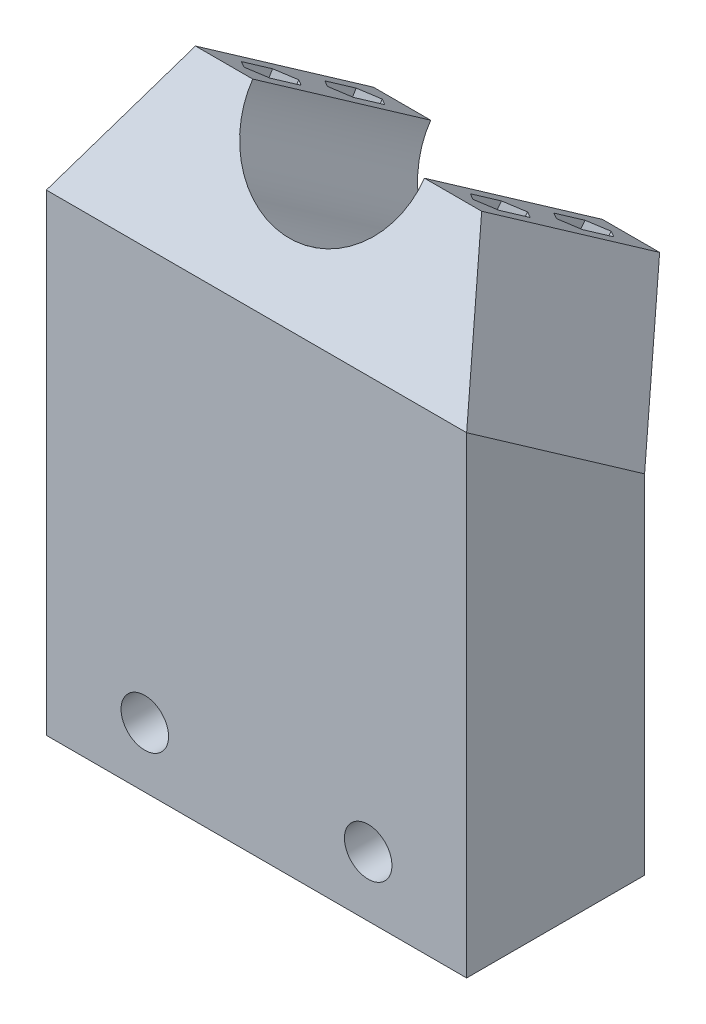
ISO-10303-21;
HEADER;
FILE_DESCRIPTION(('STEP AP214'),'2;1');
FILE_NAME('part.step','',(''),(''),'','','');
FILE_SCHEMA(('AUTOMOTIVE_DESIGN { 1 0 10303 214 1 1 1 1 }'));
ENDSEC;
DATA;
#1=APPLICATION_CONTEXT('core data for automotive mechanical design processes');
#2=APPLICATION_PROTOCOL_DEFINITION('international standard','automotive_design',2000,#1);
#3=PRODUCT_CONTEXT('',#1,'mechanical');
#4=PRODUCT('Part','Part','',(#3));
#5=PRODUCT_RELATED_PRODUCT_CATEGORY('part','',(#4));
#6=PRODUCT_DEFINITION_FORMATION('','',#4);
#7=PRODUCT_DEFINITION_CONTEXT('part definition',#1,'design');
#8=PRODUCT_DEFINITION('design','',#6,#7);
#9=PRODUCT_DEFINITION_SHAPE('','',#8);
#10=(LENGTH_UNIT() NAMED_UNIT(*) SI_UNIT(.MILLI.,.METRE.));
#11=(NAMED_UNIT(*) PLANE_ANGLE_UNIT() SI_UNIT($,.RADIAN.));
#12=(NAMED_UNIT(*) SI_UNIT($,.STERADIAN.) SOLID_ANGLE_UNIT());
#13=UNCERTAINTY_MEASURE_WITH_UNIT(LENGTH_MEASURE(1.E-05),#10,'distance_accuracy_value','');
#14=(GEOMETRIC_REPRESENTATION_CONTEXT(3) GLOBAL_UNCERTAINTY_ASSIGNED_CONTEXT((#13)) GLOBAL_UNIT_ASSIGNED_CONTEXT((#10,
#11,#12)) REPRESENTATION_CONTEXT('',''));
#15=CARTESIAN_POINT('',(0.,0.,0.));
#16=DIRECTION('',(0.,0.,1.));
#17=DIRECTION('',(1.,0.,0.));
#18=AXIS2_PLACEMENT_3D('',#15,#16,#17);
#19=CARTESIAN_POINT('',(0.,61.7872093725029,10.0494784547343));
#20=DIRECTION('',(0.,0.819152044288991,-0.573576436351047));
#21=DIRECTION('',(0.,0.573576436351048,0.819152044288991));
#22=AXIS2_PLACEMENT_3D('',#19,#20,#21);
#23=PLANE('',#22);
#24=DIRECTION('',(1.,0.,0.));
#25=VECTOR('',#24,1.);
#26=CARTESIAN_POINT('',(0.,48.7261506363349,-8.60364654526572));
#27=LINE('',#26,#25);
#28=CARTESIAN_POINT('',(7.0265625,48.7261506363349,-8.60364654526572));
#29=VERTEX_POINT('',#28);
#30=CARTESIAN_POINT('',(13.0265625,48.7261506363349,-8.60364654526572));
#31=VERTEX_POINT('',#30);
#32=EDGE_CURVE('E234',#29,#31,#27,.T.);
#33=ORIENTED_EDGE('',*,*,#32,.F.);
#34=DIRECTION('',(0.,-0.573576436351047,-0.819152044288991));
#35=VECTOR('',#34,1.);
#36=CARTESIAN_POINT('',(7.0265625,61.7872093725029,10.0494784547343));
#37=LINE('',#36,#35);
#38=CARTESIAN_POINT('',(7.0265625,61.7872093725029,10.0494784547343));
#39=VERTEX_POINT('',#38);
#40=EDGE_CURVE('E277',#39,#29,#37,.T.);
#41=ORIENTED_EDGE('',*,*,#40,.F.);
#42=DIRECTION('',(1.,0.,0.));
#43=VECTOR('',#42,1.);
#44=CARTESIAN_POINT('',(0.,61.7872093725029,10.0494784547343));
#45=LINE('',#44,#43);
#46=CARTESIAN_POINT('',(13.0265625,61.7872093725029,10.0494784547343));
#47=VERTEX_POINT('',#46);
#48=EDGE_CURVE('E235',#39,#47,#45,.T.);
#49=ORIENTED_EDGE('',*,*,#48,.T.);
#50=DIRECTION('',(0.,-0.573576436351047,-0.819152044288991));
#51=VECTOR('',#50,1.);
#52=CARTESIAN_POINT('',(13.0265625,61.7872093725029,10.0494784547343));
#53=LINE('',#52,#51);
#54=EDGE_CURVE('E251',#47,#31,#53,.T.);
#55=ORIENTED_EDGE('',*,*,#54,.T.);
#56=EDGE_LOOP('',(#33,#41,#49,#55));
#57=FACE_BOUND('',#56,.T.);
#58=DIRECTION('',(0.,0.573576436351046,0.819152044288991));
#59=VECTOR('',#58,1.);
#60=CARTESIAN_POINT('',(8.5265625,61.7872093725029,10.0494784547343));
#61=LINE('',#60,#59);
#62=CARTESIAN_POINT('',(8.5265625,53.3377051845973,-2.01766410918222));
#63=VERTEX_POINT('',#62);
#64=CARTESIAN_POINT('',(8.5265625,51.0433994391931,-5.2942722863382));
#65=VERTEX_POINT('',#64);
#66=EDGE_CURVE('E228',#63,#65,#61,.F.);
#67=ORIENTED_EDGE('',*,*,#66,.T.);
#68=DIRECTION('',(-0.707106781186548,0.405579787672639,0.579227965339568));
#69=VECTOR('',#68,1.);
#70=CARTESIAN_POINT('',(22.0265625,43.300117548454,-16.3528248842395));
#71=LINE('',#70,#69);
#72=CARTESIAN_POINT('',(10.0265625,50.1830347846665,-6.52300035277167));
#73=VERTEX_POINT('',#72);
#74=EDGE_CURVE('E231',#65,#73,#71,.F.);
#75=ORIENTED_EDGE('',*,*,#74,.T.);
#76=DIRECTION('',(0.707106781186548,0.40557978767264,0.579227965339568));
#77=VECTOR('',#76,1.);
#78=CARTESIAN_POINT('',(22.0265625,57.0659520208791,3.3068241786962));
#79=LINE('',#78,#77);
#80=CARTESIAN_POINT('',(11.5265625,51.0433994391931,-5.29427228633819));
#81=VERTEX_POINT('',#80);
#82=EDGE_CURVE('E216',#73,#81,#79,.T.);
#83=ORIENTED_EDGE('',*,*,#82,.T.);
#84=DIRECTION('',(0.,0.573576436351046,0.819152044288991));
#85=VECTOR('',#84,1.);
#86=CARTESIAN_POINT('',(11.5265625,61.7872093725029,10.0494784547343));
#87=LINE('',#86,#85);
#88=CARTESIAN_POINT('',(11.5265625,53.3377051845973,-2.01766410918222));
#89=VERTEX_POINT('',#88);
#90=EDGE_CURVE('E219',#81,#89,#87,.T.);
#91=ORIENTED_EDGE('',*,*,#90,.T.);
#92=DIRECTION('',(-0.707106781186554,0.405579787672636,0.579227965339563));
#93=VECTOR('',#92,1.);
#94=CARTESIAN_POINT('',(22.0265625,47.3151526029114,-10.6187605742164));
#95=LINE('',#94,#93);
#96=CARTESIAN_POINT('',(10.0265625,54.1980698391239,-0.788936042748746));
#97=VERTEX_POINT('',#96);
#98=EDGE_CURVE('E222',#89,#97,#95,.T.);
#99=ORIENTED_EDGE('',*,*,#98,.T.);
#100=DIRECTION('',(0.70710678118655,0.405579787672639,0.579227965339567));
#101=VECTOR('',#100,1.);
#102=CARTESIAN_POINT('',(22.0265625,61.0809870753364,9.04088848871909));
#103=LINE('',#102,#101);
#104=EDGE_CURVE('E225',#97,#63,#103,.F.);
#105=ORIENTED_EDGE('',*,*,#104,.T.);
#106=EDGE_LOOP('',(#67,#75,#83,#91,#99,#105));
#107=FACE_BOUND('',#106,.T.);
#108=DIRECTION('',(0.,0.573576436351046,0.819152044288991));
#109=VECTOR('',#108,1.);
#110=CARTESIAN_POINT('',(11.5265625,61.7872093725029,10.0494784547343));
#111=LINE('',#110,#109);
#112=CARTESIAN_POINT('',(11.5265625,57.1756548242405,3.46349601865079));
#113=VERTEX_POINT('',#112);
#114=CARTESIAN_POINT('',(11.5265625,59.4699605696447,6.74010419580678));
#115=VERTEX_POINT('',#114);
#116=EDGE_CURVE('E168',#113,#115,#111,.T.);
#117=ORIENTED_EDGE('',*,*,#116,.T.);
#118=DIRECTION('',(-0.70710678118655,0.405579787672638,0.579227965339566));
#119=VECTOR('',#118,1.);
#120=CARTESIAN_POINT('',(22.0265625,53.4474079879587,-1.86099226922756));
#121=LINE('',#120,#119);
#122=CARTESIAN_POINT('',(10.0265625,60.3303252241713,7.96883226224026));
#123=VERTEX_POINT('',#122);
#124=EDGE_CURVE('E197',#115,#123,#121,.T.);
#125=ORIENTED_EDGE('',*,*,#124,.T.);
#126=DIRECTION('',(0.70710678118655,0.405579787672638,0.579227965339566));
#127=VECTOR('',#126,1.);
#128=CARTESIAN_POINT('',(22.0265625,67.2132424603838,17.7986567937081));
#129=LINE('',#128,#127);
#130=CARTESIAN_POINT('',(8.5265625,59.4699605696447,6.74010419580678));
#131=VERTEX_POINT('',#130);
#132=EDGE_CURVE('E194',#123,#131,#129,.F.);
#133=ORIENTED_EDGE('',*,*,#132,.T.);
#134=DIRECTION('',(0.,0.573576436351046,0.819152044288991));
#135=VECTOR('',#134,1.);
#136=CARTESIAN_POINT('',(8.5265625,61.7872093725029,10.0494784547343));
#137=LINE('',#136,#135);
#138=CARTESIAN_POINT('',(8.5265625,57.1756548242405,3.46349601865081));
#139=VERTEX_POINT('',#138);
#140=EDGE_CURVE('E189',#131,#139,#137,.F.);
#141=ORIENTED_EDGE('',*,*,#140,.T.);
#142=DIRECTION('',(-0.707106781186551,0.405579787672638,0.579227965339565));
#143=VECTOR('',#142,1.);
#144=CARTESIAN_POINT('',(22.0265625,49.4323729335014,-7.59505657925045));
#145=LINE('',#144,#143);
#146=CARTESIAN_POINT('',(10.0265625,56.3152901697139,2.23476795221733));
#147=VERTEX_POINT('',#146);
#148=EDGE_CURVE('E187',#139,#147,#145,.F.);
#149=ORIENTED_EDGE('',*,*,#148,.T.);
#150=DIRECTION('',(0.707106781186556,0.405579787672635,0.579227965339561));
#151=VECTOR('',#150,1.);
#152=CARTESIAN_POINT('',(22.0265625,63.1982074059263,12.064592483685));
#153=LINE('',#152,#151);
#154=EDGE_CURVE('E173',#147,#113,#153,.T.);
#155=ORIENTED_EDGE('',*,*,#154,.T.);
#156=EDGE_LOOP('',(#117,#125,#133,#141,#149,#155));
#157=FACE_BOUND('',#156,.T.);
#158=ADVANCED_FACE('F47',(#57,#107,#157),#23,.T.);
#159=CARTESIAN_POINT('',(0.,61.7872093725029,10.0494784547343));
#160=DIRECTION('',(0.,0.819152044288991,-0.573576436351047));
#161=DIRECTION('',(0.,0.573576436351048,0.819152044288991));
#162=AXIS2_PLACEMENT_3D('',#159,#160,#161);
#163=PLANE('',#162);
#164=DIRECTION('',(1.,0.,0.));
#165=VECTOR('',#164,1.);
#166=CARTESIAN_POINT('',(0.,48.7261506363349,-8.60364654526572));
#167=LINE('',#166,#165);
#168=CARTESIAN_POINT('',(31.0265625,48.7261506363349,-8.60364654526572));
#169=VERTEX_POINT('',#168);
#170=CARTESIAN_POINT('',(37.0265625,48.7261506363349,-8.60364654526572));
#171=VERTEX_POINT('',#170);
#172=EDGE_CURVE('E261',#169,#171,#167,.T.);
#173=ORIENTED_EDGE('',*,*,#172,.F.);
#174=DIRECTION('',(0.,-0.573576436351047,-0.819152044288991));
#175=VECTOR('',#174,1.);
#176=CARTESIAN_POINT('',(31.0265625,61.7872093725029,10.0494784547343));
#177=LINE('',#176,#175);
#178=CARTESIAN_POINT('',(31.0265625,61.7872093725029,10.0494784547343));
#179=VERTEX_POINT('',#178);
#180=EDGE_CURVE('E267',#179,#169,#177,.T.);
#181=ORIENTED_EDGE('',*,*,#180,.F.);
#182=DIRECTION('',(1.,0.,0.));
#183=VECTOR('',#182,1.);
#184=CARTESIAN_POINT('',(0.,61.7872093725029,10.0494784547343));
#185=LINE('',#184,#183);
#186=CARTESIAN_POINT('',(37.0265625,61.7872093725029,10.0494784547343));
#187=VERTEX_POINT('',#186);
#188=EDGE_CURVE('E245',#179,#187,#185,.T.);
#189=ORIENTED_EDGE('',*,*,#188,.T.);
#190=DIRECTION('',(0.,-0.573576436351047,-0.819152044288991));
#191=VECTOR('',#190,1.);
#192=CARTESIAN_POINT('',(37.0265625,61.7872093725029,10.0494784547343));
#193=LINE('',#192,#191);
#194=EDGE_CURVE('E269',#187,#171,#193,.T.);
#195=ORIENTED_EDGE('',*,*,#194,.T.);
#196=EDGE_LOOP('',(#173,#181,#189,#195));
#197=FACE_BOUND('',#196,.T.);
#198=DIRECTION('',(0.707106781186548,-0.40557978767264,-0.579227965339568));
#199=VECTOR('',#198,1.);
#200=CARTESIAN_POINT('',(22.0265625,57.0659520208791,3.3068241786962));
#201=LINE('',#200,#199);
#202=CARTESIAN_POINT('',(32.5265625,51.0433994391931,-5.29427228633819));
#203=VERTEX_POINT('',#202);
#204=CARTESIAN_POINT('',(34.0265625,50.1830347846665,-6.52300035277168));
#205=VERTEX_POINT('',#204);
#206=EDGE_CURVE('E279',#203,#205,#201,.T.);
#207=ORIENTED_EDGE('',*,*,#206,.T.);
#208=DIRECTION('',(-0.707106781186548,-0.405579787672639,-0.579227965339568));
#209=VECTOR('',#208,1.);
#210=CARTESIAN_POINT('',(22.0265625,43.300117548454,-16.3528248842395));
#211=LINE('',#210,#209);
#212=CARTESIAN_POINT('',(35.5265625,51.0433994391931,-5.2942722863382));
#213=VERTEX_POINT('',#212);
#214=EDGE_CURVE('E294',#205,#213,#211,.F.);
#215=ORIENTED_EDGE('',*,*,#214,.T.);
#216=DIRECTION('',(0.,0.573576436351046,0.819152044288991));
#217=VECTOR('',#216,1.);
#218=CARTESIAN_POINT('',(35.5265625,61.7872093725029,10.0494784547343));
#219=LINE('',#218,#217);
#220=CARTESIAN_POINT('',(35.5265625,53.3377051845973,-2.01766410918222));
#221=VERTEX_POINT('',#220);
#222=EDGE_CURVE('E291',#213,#221,#219,.T.);
#223=ORIENTED_EDGE('',*,*,#222,.T.);
#224=DIRECTION('',(0.70710678118655,-0.405579787672639,-0.579227965339567));
#225=VECTOR('',#224,1.);
#226=CARTESIAN_POINT('',(22.0265625,61.0809870753364,9.04088848871909));
#227=LINE('',#226,#225);
#228=CARTESIAN_POINT('',(34.0265625,54.1980698391239,-0.788936042748746));
#229=VERTEX_POINT('',#228);
#230=EDGE_CURVE('E288',#221,#229,#227,.F.);
#231=ORIENTED_EDGE('',*,*,#230,.T.);
#232=DIRECTION('',(-0.707106781186554,-0.405579787672636,-0.579227965339563));
#233=VECTOR('',#232,1.);
#234=CARTESIAN_POINT('',(22.0265625,47.3151526029114,-10.6187605742164));
#235=LINE('',#234,#233);
#236=CARTESIAN_POINT('',(32.5265625,53.3377051845973,-2.01766410918222));
#237=VERTEX_POINT('',#236);
#238=EDGE_CURVE('E285',#229,#237,#235,.T.);
#239=ORIENTED_EDGE('',*,*,#238,.T.);
#240=DIRECTION('',(0.,0.573576436351046,0.819152044288991));
#241=VECTOR('',#240,1.);
#242=CARTESIAN_POINT('',(32.5265625,61.7872093725029,10.0494784547343));
#243=LINE('',#242,#241);
#244=EDGE_CURVE('E282',#237,#203,#243,.F.);
#245=ORIENTED_EDGE('',*,*,#244,.T.);
#246=EDGE_LOOP('',(#207,#215,#223,#231,#239,#245));
#247=FACE_BOUND('',#246,.T.);
#248=DIRECTION('',(0.70710678118655,-0.405579787672638,-0.579227965339566));
#249=VECTOR('',#248,1.);
#250=CARTESIAN_POINT('',(22.0265625,67.2132424603838,17.7986567937081));
#251=LINE('',#250,#249);
#252=CARTESIAN_POINT('',(35.5265625,59.4699605696447,6.74010419580678));
#253=VERTEX_POINT('',#252);
#254=CARTESIAN_POINT('',(34.0265625,60.3303252241713,7.96883226224026));
#255=VERTEX_POINT('',#254);
#256=EDGE_CURVE('E54',#253,#255,#251,.F.);
#257=ORIENTED_EDGE('',*,*,#256,.T.);
#258=DIRECTION('',(-0.70710678118655,-0.405579787672638,-0.579227965339566));
#259=VECTOR('',#258,1.);
#260=CARTESIAN_POINT('',(22.0265625,53.4474079879587,-1.86099226922756));
#261=LINE('',#260,#259);
#262=CARTESIAN_POINT('',(32.5265625,59.4699605696447,6.74010419580678));
#263=VERTEX_POINT('',#262);
#264=EDGE_CURVE('E12',#255,#263,#261,.T.);
#265=ORIENTED_EDGE('',*,*,#264,.T.);
#266=DIRECTION('',(0.,0.573576436351046,0.819152044288991));
#267=VECTOR('',#266,1.);
#268=CARTESIAN_POINT('',(32.5265625,61.7872093725029,10.0494784547343));
#269=LINE('',#268,#267);
#270=CARTESIAN_POINT('',(32.5265625,57.1756548242405,3.46349601865079));
#271=VERTEX_POINT('',#270);
#272=EDGE_CURVE('E297',#263,#271,#269,.F.);
#273=ORIENTED_EDGE('',*,*,#272,.T.);
#274=DIRECTION('',(0.707106781186556,-0.405579787672635,-0.579227965339561));
#275=VECTOR('',#274,1.);
#276=CARTESIAN_POINT('',(22.0265625,63.1982074059263,12.064592483685));
#277=LINE('',#276,#275);
#278=CARTESIAN_POINT('',(34.0265625,56.3152901697139,2.23476795221733));
#279=VERTEX_POINT('',#278);
#280=EDGE_CURVE('E181',#271,#279,#277,.T.);
#281=ORIENTED_EDGE('',*,*,#280,.T.);
#282=DIRECTION('',(-0.707106781186551,-0.405579787672638,-0.579227965339565));
#283=VECTOR('',#282,1.);
#284=CARTESIAN_POINT('',(22.0265625,49.4323729335014,-7.59505657925045));
#285=LINE('',#284,#283);
#286=CARTESIAN_POINT('',(35.5265625,57.1756548242405,3.46349601865081));
#287=VERTEX_POINT('',#286);
#288=EDGE_CURVE('E300',#279,#287,#285,.F.);
#289=ORIENTED_EDGE('',*,*,#288,.T.);
#290=DIRECTION('',(0.,0.573576436351046,0.819152044288991));
#291=VECTOR('',#290,1.);
#292=CARTESIAN_POINT('',(35.5265625,61.7872093725029,10.0494784547343));
#293=LINE('',#292,#291);
#294=EDGE_CURVE('E303',#287,#253,#293,.T.);
#295=ORIENTED_EDGE('',*,*,#294,.T.);
#296=EDGE_LOOP('',(#257,#265,#273,#281,#289,#295));
#297=FACE_BOUND('',#296,.T.);
#298=ADVANCED_FACE('F307',(#197,#247,#297),#163,.T.);
#299=CARTESIAN_POINT('',(-11.466289020113,29.4489419890561,32.692977049265));
#300=DIRECTION('',(0.905567661357585,-0.347485813738611,0.243312186200712));
#301=DIRECTION('',(0.358251992012855,0.933624930161369,0.));
#302=AXIS2_PLACEMENT_3D('',#299,#300,#301);
#303=PLANE('',#302);
#304=DIRECTION('',(-0.424201851367193,-0.741797601043066,0.519412272076236));
#305=VECTOR('',#304,1.);
#306=CARTESIAN_POINT('',(-11.466289020113,16.3878832528881,14.039852049265));
#307=LINE('',#306,#305);
#308=CARTESIAN_POINT('',(0.,36.438869972,0.));
#309=VERTEX_POINT('',#308);
#310=EDGE_CURVE('E254',#29,#309,#307,.T.);
#311=ORIENTED_EDGE('',*,*,#310,.T.);
#312=DIRECTION('',(0.,-0.573576436351047,-0.819152044288991));
#313=VECTOR('',#312,1.);
#314=CARTESIAN_POINT('',(0.,49.499928708168,18.653125));
#315=LINE('',#314,#313);
#316=CARTESIAN_POINT('',(0.,49.499928708168,18.653125));
#317=VERTEX_POINT('',#316);
#318=EDGE_CURVE('E274',#317,#309,#315,.T.);
#319=ORIENTED_EDGE('',*,*,#318,.F.);
#320=DIRECTION('',(-0.424201851367193,-0.741797601043066,0.519412272076236));
#321=VECTOR('',#320,1.);
#322=CARTESIAN_POINT('',(-11.466289020113,29.4489419890561,32.692977049265));
#323=LINE('',#322,#321);
#324=EDGE_CURVE('E238',#39,#317,#323,.T.);
#325=ORIENTED_EDGE('',*,*,#324,.F.);
#326=ORIENTED_EDGE('',*,*,#40,.T.);
#327=EDGE_LOOP('',(#311,#319,#325,#326));
#328=FACE_BOUND('',#327,.T.);
#329=ADVANCED_FACE('F342',(#328),#303,.F.);
#330=CARTESIAN_POINT('',(0.,49.499928708168,18.653125));
#331=DIRECTION('',(0.,0.819152044288991,-0.573576436351047));
#332=DIRECTION('',(0.,0.573576436351048,0.819152044288991));
#333=AXIS2_PLACEMENT_3D('',#330,#331,#332);
#334=PLANE('',#333);
#335=DIRECTION('',(1.,0.,0.));
#336=VECTOR('',#335,1.);
#337=CARTESIAN_POINT('',(0.,36.438869972,0.));
#338=LINE('',#337,#336);
#339=CARTESIAN_POINT('',(44.053125,36.438869972,0.));
#340=VERTEX_POINT('',#339);
#341=EDGE_CURVE('E256',#309,#340,#338,.T.);
#342=ORIENTED_EDGE('',*,*,#341,.T.);
#343=DIRECTION('',(0.,-0.573576436351047,-0.819152044288991));
#344=VECTOR('',#343,1.);
#345=CARTESIAN_POINT('',(44.053125,49.499928708168,18.653125));
#346=LINE('',#345,#344);
#347=CARTESIAN_POINT('',(44.053125,49.499928708168,18.653125));
#348=VERTEX_POINT('',#347);
#349=EDGE_CURVE('E271',#348,#340,#346,.T.);
#350=ORIENTED_EDGE('',*,*,#349,.F.);
#351=DIRECTION('',(1.,0.,0.));
#352=VECTOR('',#351,1.);
#353=CARTESIAN_POINT('',(0.,49.499928708168,18.653125));
#354=LINE('',#353,#352);
#355=EDGE_CURVE('E241',#317,#348,#354,.T.);
#356=ORIENTED_EDGE('',*,*,#355,.F.);
#357=ORIENTED_EDGE('',*,*,#318,.T.);
#358=EDGE_LOOP('',(#342,#350,#356,#357));
#359=FACE_BOUND('',#358,.T.);
#360=ADVANCED_FACE('F392',(#359),#334,.F.);
#361=CARTESIAN_POINT('',(47.5921770535968,43.3112232254751,22.9865032307414));
#362=DIRECTION('',(-0.905567661357585,-0.347485813738611,0.243312186200711));
#363=DIRECTION('',(0.358251992012855,-0.933624930161369,0.));
#364=AXIS2_PLACEMENT_3D('',#361,#362,#363);
#365=PLANE('',#364);
#366=DIRECTION('',(-0.424201851367193,0.741797601043066,-0.519412272076236));
#367=VECTOR('',#366,1.);
#368=CARTESIAN_POINT('',(47.5921770535968,30.250164489307,4.3333782307414));
#369=LINE('',#368,#367);
#370=EDGE_CURVE('E258',#340,#171,#369,.T.);
#371=ORIENTED_EDGE('',*,*,#370,.T.);
#372=ORIENTED_EDGE('',*,*,#194,.F.);
#373=DIRECTION('',(-0.424201851367193,0.741797601043066,-0.519412272076236));
#374=VECTOR('',#373,1.);
#375=CARTESIAN_POINT('',(47.5921770535968,43.3112232254751,22.9865032307414));
#376=LINE('',#375,#374);
#377=EDGE_CURVE('E243',#348,#187,#376,.T.);
#378=ORIENTED_EDGE('',*,*,#377,.F.);
#379=ORIENTED_EDGE('',*,*,#349,.T.);
#380=EDGE_LOOP('',(#371,#372,#378,#379));
#381=FACE_BOUND('',#380,.T.);
#382=ADVANCED_FACE('F387',(#381),#365,.F.);
#383=CARTESIAN_POINT('',(22.0265625,61.7872093725029,10.0494784547343));
#384=DIRECTION('',(0.,-0.573576436351047,-0.819152044288991));
#385=DIRECTION('',(0.,0.819152044288991,-0.573576436351048));
#386=AXIS2_PLACEMENT_3D('',#383,#384,#385);
#387=CYLINDRICAL_SURFACE('',#386,9.);
#388=CARTESIAN_POINT('',(22.0265625,48.7261506363349,-8.60364654526572));
#389=DIRECTION('',(0.,0.573576436351047,0.819152044288991));
#390=DIRECTION('',(0.,-0.819152044288991,0.573576436351047));
#391=AXIS2_PLACEMENT_3D('',#388,#389,#390);
#392=CIRCLE('',#391,9.);
#393=EDGE_CURVE('E239',#31,#169,#392,.T.);
#394=ORIENTED_EDGE('',*,*,#393,.F.);
#395=ORIENTED_EDGE('',*,*,#54,.F.);
#396=CARTESIAN_POINT('',(22.0265625,61.7872093725029,10.0494784547343));
#397=DIRECTION('',(0.,0.573576436351047,0.819152044288991));
#398=DIRECTION('',(0.,-0.819152044288991,0.573576436351047));
#399=AXIS2_PLACEMENT_3D('',#396,#397,#398);
#400=CIRCLE('',#399,9.);
#401=EDGE_CURVE('E248',#47,#179,#400,.T.);
#402=ORIENTED_EDGE('',*,*,#401,.T.);
#403=ORIENTED_EDGE('',*,*,#180,.T.);
#404=EDGE_LOOP('',(#394,#395,#402,#403));
#405=FACE_BOUND('',#404,.T.);
#406=ADVANCED_FACE('F381',(#405),#387,.F.);
#407=CARTESIAN_POINT('',(0.,25.0490799569437,35.7737936112328));
#408=DIRECTION('',(0.,0.573576436351047,0.819152044288991));
#409=DIRECTION('',(0.,-0.819152044288991,0.573576436351047));
#410=AXIS2_PLACEMENT_3D('',#407,#408,#409);
#411=PLANE('',#410);
#412=ORIENTED_EDGE('',*,*,#48,.F.);
#413=ORIENTED_EDGE('',*,*,#324,.T.);
#414=ORIENTED_EDGE('',*,*,#355,.T.);
#415=ORIENTED_EDGE('',*,*,#377,.T.);
#416=ORIENTED_EDGE('',*,*,#188,.F.);
#417=ORIENTED_EDGE('',*,*,#401,.F.);
#418=EDGE_LOOP('',(#412,#413,#414,#415,#416,#417));
#419=FACE_BOUND('',#418,.T.);
#420=ADVANCED_FACE('F378',(#419),#411,.T.);
#421=CARTESIAN_POINT('',(0.,11.9880212207756,17.1206686112328));
#422=DIRECTION('',(0.,0.573576436351047,0.819152044288991));
#423=DIRECTION('',(0.,-0.819152044288991,0.573576436351047));
#424=AXIS2_PLACEMENT_3D('',#421,#422,#423);
#425=PLANE('',#424);
#426=ORIENTED_EDGE('',*,*,#32,.T.);
#427=ORIENTED_EDGE('',*,*,#393,.T.);
#428=ORIENTED_EDGE('',*,*,#172,.T.);
#429=ORIENTED_EDGE('',*,*,#370,.F.);
#430=ORIENTED_EDGE('',*,*,#341,.F.);
#431=ORIENTED_EDGE('',*,*,#310,.F.);
#432=EDGE_LOOP('',(#426,#427,#428,#429,#430,#431));
#433=FACE_BOUND('',#432,.T.);
#434=ADVANCED_FACE('F377',(#433),#425,.F.);
#435=CARTESIAN_POINT('',(22.0265625,50.1830347846666,-6.5230003527717));
#436=DIRECTION('',(0.,0.573576436351046,0.819152044288991));
#437=DIRECTION('',(0.,-0.819152044288991,0.573576436351046));
#438=AXIS2_PLACEMENT_3D('',#435,#436,#437);
#439=CONICAL_SURFACE('',#438,12.,0.78539816339745);
#440=CARTESIAN_POINT('',(22.0265625,51.0433994391932,-5.29427228633822));
#441=DIRECTION('',(0.,0.573576436351046,0.819152044288991));
#442=DIRECTION('',(0.,-0.819152044288991,0.573576436351046));
#443=AXIS2_PLACEMENT_3D('',#440,#441,#442);
#444=CIRCLE('',#443,13.5);
#445=EDGE_CURVE('E213',#65,#213,#444,.T.);
#446=ORIENTED_EDGE('',*,*,#445,.T.);
#447=ORIENTED_EDGE('',*,*,#214,.F.);
#448=CARTESIAN_POINT('',(22.0265625,50.1830347846666,-6.5230003527717));
#449=DIRECTION('',(0.,0.573576436351046,0.819152044288991));
#450=DIRECTION('',(0.,-0.819152044288991,0.573576436351046));
#451=AXIS2_PLACEMENT_3D('',#448,#449,#450);
#452=CIRCLE('',#451,12.);
#453=EDGE_CURVE('E199',#73,#205,#452,.T.);
#454=ORIENTED_EDGE('',*,*,#453,.F.);
#455=ORIENTED_EDGE('',*,*,#74,.F.);
#456=EDGE_LOOP('',(#446,#447,#454,#455));
#457=FACE_BOUND('',#456,.T.);
#458=ADVANCED_FACE('F357',(#457),#439,.F.);
#459=CARTESIAN_POINT('',(22.0265625,61.7872093725029,10.0494784547343));
#460=DIRECTION('',(0.,0.573576436351046,0.819152044288991));
#461=DIRECTION('',(0.,-0.819152044288991,0.573576436351046));
#462=AXIS2_PLACEMENT_3D('',#459,#460,#461);
#463=CYLINDRICAL_SURFACE('',#462,13.5);
#464=CARTESIAN_POINT('',(22.0265625,53.3377051845973,-2.01766410918225));
#465=DIRECTION('',(0.,0.573576436351046,0.819152044288991));
#466=DIRECTION('',(0.,-0.819152044288991,0.573576436351046));
#467=AXIS2_PLACEMENT_3D('',#464,#465,#466);
#468=CIRCLE('',#467,13.5);
#469=EDGE_CURVE('E210',#63,#221,#468,.T.);
#470=ORIENTED_EDGE('',*,*,#469,.T.);
#471=ORIENTED_EDGE('',*,*,#222,.F.);
#472=ORIENTED_EDGE('',*,*,#445,.F.);
#473=ORIENTED_EDGE('',*,*,#66,.F.);
#474=EDGE_LOOP('',(#470,#471,#472,#473));
#475=FACE_BOUND('',#474,.T.);
#476=ADVANCED_FACE('F350',(#475),#463,.F.);
#477=CARTESIAN_POINT('',(22.0265625,53.3377051845973,-2.01766410918225));
#478=DIRECTION('',(0.,-0.573576436351046,-0.819152044288991));
#479=DIRECTION('',(0.,0.819152044288991,-0.573576436351046));
#480=AXIS2_PLACEMENT_3D('',#477,#478,#479);
#481=CONICAL_SURFACE('',#480,13.5,0.785398163397451);
#482=CARTESIAN_POINT('',(22.0265625,54.1980698391239,-0.78893604274877));
#483=DIRECTION('',(0.,0.573576436351046,0.819152044288991));
#484=DIRECTION('',(0.,-0.819152044288991,0.573576436351046));
#485=AXIS2_PLACEMENT_3D('',#482,#483,#484);
#486=CIRCLE('',#485,12.);
#487=EDGE_CURVE('E207',#97,#229,#486,.T.);
#488=ORIENTED_EDGE('',*,*,#487,.T.);
#489=ORIENTED_EDGE('',*,*,#230,.F.);
#490=ORIENTED_EDGE('',*,*,#469,.F.);
#491=ORIENTED_EDGE('',*,*,#104,.F.);
#492=EDGE_LOOP('',(#488,#489,#490,#491));
#493=FACE_BOUND('',#492,.T.);
#494=ADVANCED_FACE('F352',(#493),#481,.F.);
#495=CARTESIAN_POINT('',(22.0265625,54.1980698391239,-0.78893604274877));
#496=DIRECTION('',(0.,0.573576436351046,0.819152044288991));
#497=DIRECTION('',(0.,-0.819152044288991,0.573576436351046));
#498=AXIS2_PLACEMENT_3D('',#495,#496,#497);
#499=CONICAL_SURFACE('',#498,12.,0.785398163397458);
#500=CARTESIAN_POINT('',(22.0265625,53.3377051845973,-2.01766410918224));
#501=DIRECTION('',(0.,0.573576436351046,0.819152044288991));
#502=DIRECTION('',(0.,-0.819152044288991,0.573576436351046));
#503=AXIS2_PLACEMENT_3D('',#500,#501,#502);
#504=CIRCLE('',#503,10.5);
#505=EDGE_CURVE('E204',#89,#237,#504,.T.);
#506=ORIENTED_EDGE('',*,*,#505,.T.);
#507=ORIENTED_EDGE('',*,*,#238,.F.);
#508=ORIENTED_EDGE('',*,*,#487,.F.);
#509=ORIENTED_EDGE('',*,*,#98,.F.);
#510=EDGE_LOOP('',(#506,#507,#508,#509));
#511=FACE_BOUND('',#510,.T.);
#512=ADVANCED_FACE('F363',(#511),#499,.T.);
#513=CARTESIAN_POINT('',(22.0265625,61.7872093725029,10.0494784547343));
#514=DIRECTION('',(0.,0.573576436351046,0.819152044288991));
#515=DIRECTION('',(0.,-0.819152044288991,0.573576436351046));
#516=AXIS2_PLACEMENT_3D('',#513,#514,#515);
#517=CYLINDRICAL_SURFACE('',#516,10.5);
#518=CARTESIAN_POINT('',(22.0265625,51.0433994391932,-5.29427228633822));
#519=DIRECTION('',(0.,0.573576436351046,0.819152044288991));
#520=DIRECTION('',(0.,-0.819152044288991,0.573576436351046));
#521=AXIS2_PLACEMENT_3D('',#518,#519,#520);
#522=CIRCLE('',#521,10.5);
#523=EDGE_CURVE('E201',#81,#203,#522,.T.);
#524=ORIENTED_EDGE('',*,*,#523,.T.);
#525=ORIENTED_EDGE('',*,*,#244,.F.);
#526=ORIENTED_EDGE('',*,*,#505,.F.);
#527=ORIENTED_EDGE('',*,*,#90,.F.);
#528=EDGE_LOOP('',(#524,#525,#526,#527));
#529=FACE_BOUND('',#528,.T.);
#530=ADVANCED_FACE('F334',(#529),#517,.T.);
#531=CARTESIAN_POINT('',(22.0265625,51.0433994391932,-5.29427228633822));
#532=DIRECTION('',(0.,-0.573576436351046,-0.819152044288991));
#533=DIRECTION('',(0.,0.819152044288991,-0.573576436351046));
#534=AXIS2_PLACEMENT_3D('',#531,#532,#533);
#535=CONICAL_SURFACE('',#534,10.5,0.785398163397449);
#536=ORIENTED_EDGE('',*,*,#453,.T.);
#537=ORIENTED_EDGE('',*,*,#206,.F.);
#538=ORIENTED_EDGE('',*,*,#523,.F.);
#539=ORIENTED_EDGE('',*,*,#82,.F.);
#540=EDGE_LOOP('',(#536,#537,#538,#539));
#541=FACE_BOUND('',#540,.T.);
#542=ADVANCED_FACE('F327',(#541),#535,.T.);
#543=CARTESIAN_POINT('',(22.0265625,60.3303252241713,7.96883226224024));
#544=DIRECTION('',(0.,0.573576436351046,0.819152044288991));
#545=DIRECTION('',(0.,-0.819152044288991,0.573576436351046));
#546=AXIS2_PLACEMENT_3D('',#543,#544,#545);
#547=CONICAL_SURFACE('',#546,12.,0.785398163397452);
#548=CARTESIAN_POINT('',(22.0265625,59.4699605696447,6.74010419580676));
#549=DIRECTION('',(0.,0.573576436351046,0.819152044288991));
#550=DIRECTION('',(0.,-0.819152044288991,0.573576436351046));
#551=AXIS2_PLACEMENT_3D('',#548,#549,#550);
#552=CIRCLE('',#551,10.5);
#553=EDGE_CURVE('E61',#115,#263,#552,.T.);
#554=ORIENTED_EDGE('',*,*,#553,.T.);
#555=ORIENTED_EDGE('',*,*,#264,.F.);
#556=CARTESIAN_POINT('',(22.0265625,60.3303252241713,7.96883226224024));
#557=DIRECTION('',(0.,0.573576436351046,0.819152044288991));
#558=DIRECTION('',(0.,-0.819152044288991,0.573576436351046));
#559=AXIS2_PLACEMENT_3D('',#556,#557,#558);
#560=CIRCLE('',#559,12.);
#561=EDGE_CURVE('E174',#123,#255,#560,.T.);
#562=ORIENTED_EDGE('',*,*,#561,.F.);
#563=ORIENTED_EDGE('',*,*,#124,.F.);
#564=EDGE_LOOP('',(#554,#555,#562,#563));
#565=FACE_BOUND('',#564,.T.);
#566=ADVANCED_FACE('F325',(#565),#547,.T.);
#567=CARTESIAN_POINT('',(22.0265625,59.4699605696447,6.74010419580676));
#568=DIRECTION('',(0.,-0.573576436351046,-0.819152044288991));
#569=DIRECTION('',(0.,0.819152044288991,-0.573576436351046));
#570=AXIS2_PLACEMENT_3D('',#567,#568,#569);
#571=CONICAL_SURFACE('',#570,13.5,0.785398163397452);
#572=ORIENTED_EDGE('',*,*,#561,.T.);
#573=ORIENTED_EDGE('',*,*,#256,.F.);
#574=CARTESIAN_POINT('',(22.0265625,59.4699605696447,6.74010419580676));
#575=DIRECTION('',(0.,0.573576436351046,0.819152044288991));
#576=DIRECTION('',(0.,-0.819152044288991,0.573576436351046));
#577=AXIS2_PLACEMENT_3D('',#574,#575,#576);
#578=CIRCLE('',#577,13.5);
#579=EDGE_CURVE('E313',#131,#253,#578,.T.);
#580=ORIENTED_EDGE('',*,*,#579,.F.);
#581=ORIENTED_EDGE('',*,*,#132,.F.);
#582=EDGE_LOOP('',(#572,#573,#580,#581));
#583=FACE_BOUND('',#582,.T.);
#584=ADVANCED_FACE('F312',(#583),#571,.F.);
#585=CARTESIAN_POINT('',(22.0265625,61.7872093725029,10.0494784547343));
#586=DIRECTION('',(0.,0.573576436351046,0.819152044288991));
#587=DIRECTION('',(0.,-0.819152044288991,0.573576436351046));
#588=AXIS2_PLACEMENT_3D('',#585,#586,#587);
#589=CYLINDRICAL_SURFACE('',#588,13.5);
#590=ORIENTED_EDGE('',*,*,#579,.T.);
#591=ORIENTED_EDGE('',*,*,#294,.F.);
#592=CARTESIAN_POINT('',(22.0265625,57.1756548242405,3.46349601865079));
#593=DIRECTION('',(0.,0.573576436351046,0.819152044288991));
#594=DIRECTION('',(0.,-0.819152044288991,0.573576436351046));
#595=AXIS2_PLACEMENT_3D('',#592,#593,#594);
#596=CIRCLE('',#595,13.5);
#597=EDGE_CURVE('E319',#139,#287,#596,.T.);
#598=ORIENTED_EDGE('',*,*,#597,.F.);
#599=ORIENTED_EDGE('',*,*,#140,.F.);
#600=EDGE_LOOP('',(#590,#591,#598,#599));
#601=FACE_BOUND('',#600,.T.);
#602=ADVANCED_FACE('F316',(#601),#589,.F.);
#603=CARTESIAN_POINT('',(22.0265625,56.315290169714,2.23476795221731));
#604=DIRECTION('',(0.,0.573576436351046,0.819152044288991));
#605=DIRECTION('',(0.,-0.819152044288991,0.573576436351046));
#606=AXIS2_PLACEMENT_3D('',#603,#604,#605);
#607=CONICAL_SURFACE('',#606,12.,0.785398163397454);
#608=ORIENTED_EDGE('',*,*,#597,.T.);
#609=ORIENTED_EDGE('',*,*,#288,.F.);
#610=CARTESIAN_POINT('',(22.0265625,56.315290169714,2.23476795221731));
#611=DIRECTION('',(0.,0.573576436351046,0.819152044288991));
#612=DIRECTION('',(0.,-0.819152044288991,0.573576436351046));
#613=AXIS2_PLACEMENT_3D('',#610,#611,#612);
#614=CIRCLE('',#613,12.);
#615=EDGE_CURVE('E183',#147,#279,#614,.T.);
#616=ORIENTED_EDGE('',*,*,#615,.F.);
#617=ORIENTED_EDGE('',*,*,#148,.F.);
#618=EDGE_LOOP('',(#608,#609,#616,#617));
#619=FACE_BOUND('',#618,.T.);
#620=ADVANCED_FACE('F483',(#619),#607,.F.);
#621=CARTESIAN_POINT('',(22.0265625,57.1756548242405,3.46349601865078));
#622=DIRECTION('',(0.,-0.573576436351046,-0.819152044288991));
#623=DIRECTION('',(0.,0.819152044288991,-0.573576436351046));
#624=AXIS2_PLACEMENT_3D('',#621,#622,#623);
#625=CONICAL_SURFACE('',#624,10.5,0.785398163397461);
#626=ORIENTED_EDGE('',*,*,#615,.T.);
#627=ORIENTED_EDGE('',*,*,#280,.F.);
#628=CARTESIAN_POINT('',(22.0265625,57.1756548242405,3.46349601865078));
#629=DIRECTION('',(0.,0.573576436351046,0.819152044288991));
#630=DIRECTION('',(0.,-0.819152044288991,0.573576436351046));
#631=AXIS2_PLACEMENT_3D('',#628,#629,#630);
#632=CIRCLE('',#631,10.5);
#633=EDGE_CURVE('E66',#113,#271,#632,.T.);
#634=ORIENTED_EDGE('',*,*,#633,.F.);
#635=ORIENTED_EDGE('',*,*,#154,.F.);
#636=EDGE_LOOP('',(#626,#627,#634,#635));
#637=FACE_BOUND('',#636,.T.);
#638=ADVANCED_FACE('F178',(#637),#625,.T.);
#639=CARTESIAN_POINT('',(22.0265625,61.7872093725029,10.0494784547343));
#640=DIRECTION('',(0.,0.573576436351046,0.819152044288991));
#641=DIRECTION('',(0.,-0.819152044288991,0.573576436351046));
#642=AXIS2_PLACEMENT_3D('',#639,#640,#641);
#643=CYLINDRICAL_SURFACE('',#642,10.5);
#644=ORIENTED_EDGE('',*,*,#633,.T.);
#645=ORIENTED_EDGE('',*,*,#272,.F.);
#646=ORIENTED_EDGE('',*,*,#553,.F.);
#647=ORIENTED_EDGE('',*,*,#116,.F.);
#648=EDGE_LOOP('',(#644,#645,#646,#647));
#649=FACE_BOUND('',#648,.T.);
#650=ADVANCED_FACE('F169',(#649),#643,.T.);
#651=CLOSED_SHELL('',(#158,#298,#329,#360,#382,#406,#420,#434,#458,#476,#494,#512,#530,#542,
#566,#584,#602,#620,#638,#650));
#652=MANIFOLD_SOLID_BREP('B2',#651);
#653=CARTESIAN_POINT('',(0.,0.,18.653125));
#654=DIRECTION('',(0.,0.,-1.));
#655=DIRECTION('',(-1.,0.,0.));
#656=AXIS2_PLACEMENT_3D('',#653,#654,#655);
#657=PLANE('',#656);
#658=DIRECTION('',(0.,-1.,0.));
#659=VECTOR('',#658,1.);
#660=CARTESIAN_POINT('',(0.,0.,18.653125));
#661=LINE('',#660,#659);
#662=CARTESIAN_POINT('',(0.,49.499928708168,18.653125));
#663=VERTEX_POINT('',#662);
#664=CARTESIAN_POINT('',(0.,0.,18.653125));
#665=VERTEX_POINT('',#664);
#666=EDGE_CURVE('E612',#663,#665,#661,.T.);
#667=ORIENTED_EDGE('',*,*,#666,.T.);
#668=DIRECTION('',(1.,0.,0.));
#669=VECTOR('',#668,1.);
#670=CARTESIAN_POINT('',(0.,0.,18.653125));
#671=LINE('',#670,#669);
#672=CARTESIAN_POINT('',(44.053125,0.,18.653125));
#673=VERTEX_POINT('',#672);
#674=EDGE_CURVE('E574',#665,#673,#671,.T.);
#675=ORIENTED_EDGE('',*,*,#674,.T.);
#676=DIRECTION('',(0.,1.,0.));
#677=VECTOR('',#676,1.);
#678=CARTESIAN_POINT('',(44.053125,0.,18.653125));
#679=LINE('',#678,#677);
#680=CARTESIAN_POINT('',(44.053125,49.499928708168,18.653125));
#681=VERTEX_POINT('',#680);
#682=EDGE_CURVE('E635',#673,#681,#679,.T.);
#683=ORIENTED_EDGE('',*,*,#682,.T.);
#684=DIRECTION('',(-1.,0.,0.));
#685=VECTOR('',#684,1.);
#686=CARTESIAN_POINT('',(44.053125,49.499928708168,18.653125));
#687=LINE('',#686,#685);
#688=EDGE_CURVE('E618',#681,#663,#687,.T.);
#689=ORIENTED_EDGE('',*,*,#688,.T.);
#690=EDGE_LOOP('',(#667,#675,#683,#689));
#691=FACE_BOUND('',#690,.T.);
#692=CARTESIAN_POINT('',(10.31875,6.2992,18.653125));
#693=DIRECTION('',(0.,0.,1.));
#694=DIRECTION('',(1.,0.,0.));
#695=AXIS2_PLACEMENT_3D('',#692,#693,#694);
#696=CIRCLE('',#695,2.4892);
#697=CARTESIAN_POINT('',(12.80795,6.2992,18.653125));
#698=VERTEX_POINT('',#697);
#699=EDGE_CURVE('E601',#698,#698,#696,.T.);
#700=ORIENTED_EDGE('',*,*,#699,.F.);
#701=EDGE_LOOP('',(#700));
#702=FACE_BOUND('',#701,.T.);
#703=CARTESIAN_POINT('',(33.734375,6.2992,18.653125));
#704=DIRECTION('',(0.,0.,1.));
#705=DIRECTION('',(-1.,0.,0.));
#706=AXIS2_PLACEMENT_3D('',#703,#704,#705);
#707=CIRCLE('',#706,2.4892);
#708=CARTESIAN_POINT('',(31.245175,6.2992,18.653125));
#709=VERTEX_POINT('',#708);
#710=EDGE_CURVE('E623',#709,#709,#707,.T.);
#711=ORIENTED_EDGE('',*,*,#710,.F.);
#712=EDGE_LOOP('',(#711));
#713=FACE_BOUND('',#712,.T.);
#714=ADVANCED_FACE('F557',(#691,#702,#713),#657,.F.);
#715=CARTESIAN_POINT('',(0.,0.,0.));
#716=DIRECTION('',(0.,0.,-1.));
#717=DIRECTION('',(-1.,0.,0.));
#718=AXIS2_PLACEMENT_3D('',#715,#716,#717);
#719=PLANE('',#718);
#720=CARTESIAN_POINT('',(10.31875,6.2992,0.));
#721=DIRECTION('',(0.,0.,1.));
#722=DIRECTION('',(1.,0.,0.));
#723=AXIS2_PLACEMENT_3D('',#720,#721,#722);
#724=CIRCLE('',#723,2.4892);
#725=CARTESIAN_POINT('',(12.80795,6.2992,0.));
#726=VERTEX_POINT('',#725);
#727=EDGE_CURVE('E626',#726,#726,#724,.T.);
#728=ORIENTED_EDGE('',*,*,#727,.T.);
#729=EDGE_LOOP('',(#728));
#730=FACE_BOUND('',#729,.T.);
#731=DIRECTION('',(0.,-1.,0.));
#732=VECTOR('',#731,1.);
#733=CARTESIAN_POINT('',(0.,0.,0.));
#734=LINE('',#733,#732);
#735=CARTESIAN_POINT('',(0.,36.438869972,0.));
#736=VERTEX_POINT('',#735);
#737=CARTESIAN_POINT('',(0.,0.,0.));
#738=VERTEX_POINT('',#737);
#739=EDGE_CURVE('E591',#736,#738,#734,.T.);
#740=ORIENTED_EDGE('',*,*,#739,.F.);
#741=DIRECTION('',(-1.,0.,0.));
#742=VECTOR('',#741,1.);
#743=CARTESIAN_POINT('',(0.,36.438869972,0.));
#744=LINE('',#743,#742);
#745=CARTESIAN_POINT('',(44.053125,36.438869972,0.));
#746=VERTEX_POINT('',#745);
#747=EDGE_CURVE('E596',#746,#736,#744,.T.);
#748=ORIENTED_EDGE('',*,*,#747,.F.);
#749=DIRECTION('',(0.,1.,0.));
#750=VECTOR('',#749,1.);
#751=CARTESIAN_POINT('',(44.053125,0.,0.));
#752=LINE('',#751,#750);
#753=CARTESIAN_POINT('',(44.053125,0.,0.));
#754=VERTEX_POINT('',#753);
#755=EDGE_CURVE('E613',#754,#746,#752,.T.);
#756=ORIENTED_EDGE('',*,*,#755,.F.);
#757=DIRECTION('',(1.,0.,0.));
#758=VECTOR('',#757,1.);
#759=CARTESIAN_POINT('',(0.,0.,0.));
#760=LINE('',#759,#758);
#761=EDGE_CURVE('E585',#738,#754,#760,.T.);
#762=ORIENTED_EDGE('',*,*,#761,.F.);
#763=EDGE_LOOP('',(#740,#748,#756,#762));
#764=FACE_BOUND('',#763,.T.);
#765=CARTESIAN_POINT('',(33.734375,6.2992,0.));
#766=DIRECTION('',(0.,0.,1.));
#767=DIRECTION('',(-1.,0.,0.));
#768=AXIS2_PLACEMENT_3D('',#765,#766,#767);
#769=CIRCLE('',#768,2.4892);
#770=CARTESIAN_POINT('',(31.245175,6.2992,0.));
#771=VERTEX_POINT('',#770);
#772=EDGE_CURVE('E622',#771,#771,#769,.T.);
#773=ORIENTED_EDGE('',*,*,#772,.T.);
#774=EDGE_LOOP('',(#773));
#775=FACE_BOUND('',#774,.T.);
#776=ADVANCED_FACE('F593',(#730,#764,#775),#719,.T.);
#777=CARTESIAN_POINT('',(0.,0.,18.653125));
#778=DIRECTION('',(1.,0.,0.));
#779=DIRECTION('',(0.,0.,-1.));
#780=AXIS2_PLACEMENT_3D('',#777,#778,#779);
#781=PLANE('',#780);
#782=ORIENTED_EDGE('',*,*,#739,.T.);
#783=DIRECTION('',(0.,0.,-1.));
#784=VECTOR('',#783,1.);
#785=CARTESIAN_POINT('',(0.,0.,18.653125));
#786=LINE('',#785,#784);
#787=EDGE_CURVE('E45',#665,#738,#786,.T.);
#788=ORIENTED_EDGE('',*,*,#787,.F.);
#789=ORIENTED_EDGE('',*,*,#666,.F.);
#790=DIRECTION('',(0.,-0.573576436351047,-0.819152044288991));
#791=VECTOR('',#790,1.);
#792=CARTESIAN_POINT('',(0.,36.438869972,0.));
#793=LINE('',#792,#791);
#794=EDGE_CURVE('E609',#663,#736,#793,.T.);
#795=ORIENTED_EDGE('',*,*,#794,.T.);
#796=EDGE_LOOP('',(#782,#788,#789,#795));
#797=FACE_BOUND('',#796,.T.);
#798=ADVANCED_FACE('F559',(#797),#781,.F.);
#799=CARTESIAN_POINT('',(0.,0.,18.653125));
#800=DIRECTION('',(0.,1.,0.));
#801=DIRECTION('',(0.,0.,1.));
#802=AXIS2_PLACEMENT_3D('',#799,#800,#801);
#803=PLANE('',#802);
#804=ORIENTED_EDGE('',*,*,#761,.T.);
#805=DIRECTION('',(0.,0.,-1.));
#806=VECTOR('',#805,1.);
#807=CARTESIAN_POINT('',(44.053125,0.,18.653125));
#808=LINE('',#807,#806);
#809=EDGE_CURVE('E566',#673,#754,#808,.T.);
#810=ORIENTED_EDGE('',*,*,#809,.F.);
#811=ORIENTED_EDGE('',*,*,#674,.F.);
#812=ORIENTED_EDGE('',*,*,#787,.T.);
#813=EDGE_LOOP('',(#804,#810,#811,#812));
#814=FACE_BOUND('',#813,.T.);
#815=ADVANCED_FACE('F641',(#814),#803,.F.);
#816=CARTESIAN_POINT('',(44.053125,0.,18.653125));
#817=DIRECTION('',(-1.,0.,0.));
#818=DIRECTION('',(0.,0.,1.));
#819=AXIS2_PLACEMENT_3D('',#816,#817,#818);
#820=PLANE('',#819);
#821=ORIENTED_EDGE('',*,*,#755,.T.);
#822=DIRECTION('',(0.,-0.573576436351047,-0.819152044288991));
#823=VECTOR('',#822,1.);
#824=CARTESIAN_POINT('',(44.053125,36.438869972,0.));
#825=LINE('',#824,#823);
#826=EDGE_CURVE('E611',#681,#746,#825,.T.);
#827=ORIENTED_EDGE('',*,*,#826,.F.);
#828=ORIENTED_EDGE('',*,*,#682,.F.);
#829=ORIENTED_EDGE('',*,*,#809,.T.);
#830=EDGE_LOOP('',(#821,#827,#828,#829));
#831=FACE_BOUND('',#830,.T.);
#832=ADVANCED_FACE('F640',(#831),#820,.F.);
#833=CARTESIAN_POINT('',(10.31875,6.2992,18.653125));
#834=DIRECTION('',(0.,0.,-1.));
#835=DIRECTION('',(-1.,0.,0.));
#836=AXIS2_PLACEMENT_3D('',#833,#834,#835);
#837=CYLINDRICAL_SURFACE('',#836,2.4892);
#838=ORIENTED_EDGE('',*,*,#699,.T.);
#839=EDGE_LOOP('',(#838));
#840=FACE_BOUND('',#839,.T.);
#841=ORIENTED_EDGE('',*,*,#727,.F.);
#842=EDGE_LOOP('',(#841));
#843=FACE_BOUND('',#842,.T.);
#844=ADVANCED_FACE('F655',(#840,#843),#837,.F.);
#845=CARTESIAN_POINT('',(33.734375,6.2992,18.653125));
#846=DIRECTION('',(0.,0.,-1.));
#847=DIRECTION('',(-1.,0.,0.));
#848=AXIS2_PLACEMENT_3D('',#845,#846,#847);
#849=CYLINDRICAL_SURFACE('',#848,2.4892);
#850=ORIENTED_EDGE('',*,*,#710,.T.);
#851=EDGE_LOOP('',(#850));
#852=FACE_BOUND('',#851,.T.);
#853=ORIENTED_EDGE('',*,*,#772,.F.);
#854=EDGE_LOOP('',(#853));
#855=FACE_BOUND('',#854,.T.);
#856=ADVANCED_FACE('F652',(#852,#855),#849,.F.);
#857=CARTESIAN_POINT('',(44.053125,36.438869972,0.));
#858=DIRECTION('',(0.,0.819152044288991,-0.573576436351047));
#859=DIRECTION('',(0.,0.573576436351047,0.819152044288991));
#860=AXIS2_PLACEMENT_3D('',#857,#858,#859);
#861=PLANE('',#860);
#862=ORIENTED_EDGE('',*,*,#794,.F.);
#863=ORIENTED_EDGE('',*,*,#688,.F.);
#864=ORIENTED_EDGE('',*,*,#826,.T.);
#865=ORIENTED_EDGE('',*,*,#747,.T.);
#866=EDGE_LOOP('',(#862,#863,#864,#865));
#867=FACE_BOUND('',#866,.T.);
#868=ADVANCED_FACE('F606',(#867),#861,.T.);
#869=CLOSED_SHELL('',(#714,#776,#798,#815,#832,#844,#856,#868));
#870=MANIFOLD_SOLID_BREP('B6',#869);
#871=ADVANCED_BREP_SHAPE_REPRESENTATION('',(#18,#652,#870),#14);
#872=SHAPE_DEFINITION_REPRESENTATION(#9,#871);
ENDSEC;
END-ISO-10303-21;
